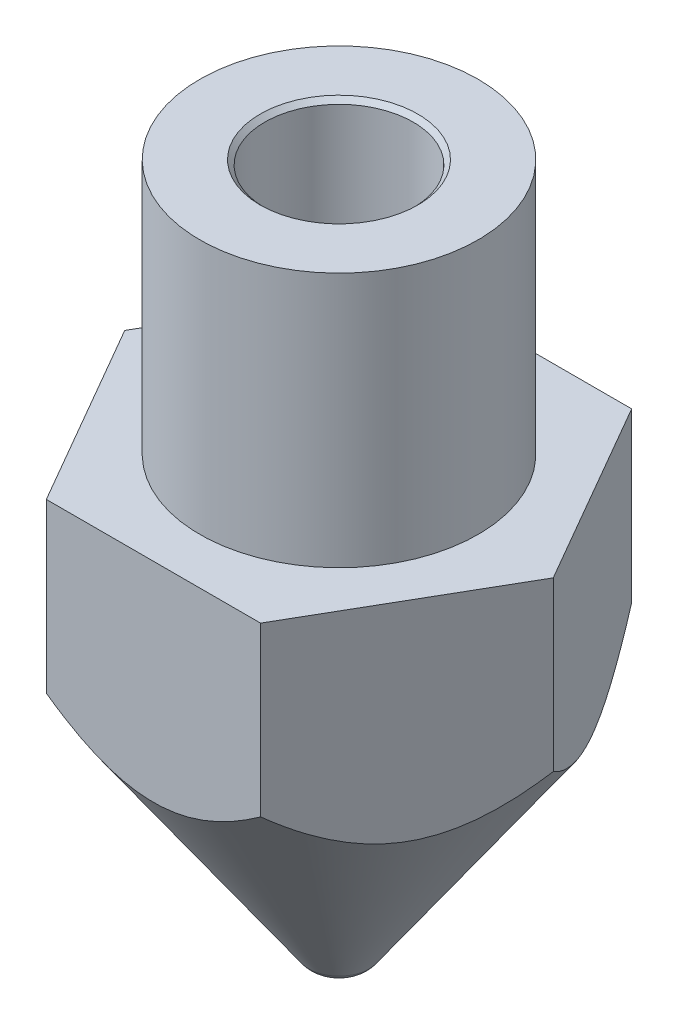
ISO-10303-21;
HEADER;
FILE_DESCRIPTION(('STEP AP214'),'2;1');
FILE_NAME('part.step','',(''),(''),'','','');
FILE_SCHEMA(('AUTOMOTIVE_DESIGN { 1 0 10303 214 1 1 1 1 }'));
ENDSEC;
DATA;
#1=APPLICATION_CONTEXT('core data for automotive mechanical design processes');
#2=APPLICATION_PROTOCOL_DEFINITION('international standard','automotive_design',2000,#1);
#3=PRODUCT_CONTEXT('',#1,'mechanical');
#4=PRODUCT('Part','Part','',(#3));
#5=PRODUCT_RELATED_PRODUCT_CATEGORY('part','',(#4));
#6=PRODUCT_DEFINITION_FORMATION('','',#4);
#7=PRODUCT_DEFINITION_CONTEXT('part definition',#1,'design');
#8=PRODUCT_DEFINITION('design','',#6,#7);
#9=PRODUCT_DEFINITION_SHAPE('','',#8);
#10=(LENGTH_UNIT() NAMED_UNIT(*) SI_UNIT(.MILLI.,.METRE.));
#11=(NAMED_UNIT(*) PLANE_ANGLE_UNIT() SI_UNIT($,.RADIAN.));
#12=(NAMED_UNIT(*) SI_UNIT($,.STERADIAN.) SOLID_ANGLE_UNIT());
#13=UNCERTAINTY_MEASURE_WITH_UNIT(LENGTH_MEASURE(1.E-05),#10,'distance_accuracy_value','');
#14=(GEOMETRIC_REPRESENTATION_CONTEXT(3) GLOBAL_UNCERTAINTY_ASSIGNED_CONTEXT((#13)) GLOBAL_UNIT_ASSIGNED_CONTEXT((#10,
#11,#12)) REPRESENTATION_CONTEXT('',''));
#15=CARTESIAN_POINT('',(0.,0.,0.));
#16=DIRECTION('',(0.,0.,1.));
#17=DIRECTION('',(1.,0.,0.));
#18=AXIS2_PLACEMENT_3D('',#15,#16,#17);
#19=CARTESIAN_POINT('',(-4.61880215351701,4.5,0.));
#20=DIRECTION('',(-0.866025403784439,0.,0.5));
#21=DIRECTION('',(0.5,0.,0.866025403784439));
#22=AXIS2_PLACEMENT_3D('',#19,#20,#21);
#23=PLANE('',#22);
#24=DIRECTION('',(0.,1.,0.));
#25=VECTOR('',#24,1.);
#26=CARTESIAN_POINT('',(-4.61880215351701,4.5,0.));
#27=LINE('',#26,#25);
#28=CARTESIAN_POINT('',(-4.61880215351701,5.88225908571051,0.));
#29=VERTEX_POINT('',#28);
#30=CARTESIAN_POINT('',(-4.61880215351701,9.5,0.));
#31=VERTEX_POINT('',#30);
#32=EDGE_CURVE('E71',#29,#31,#27,.T.);
#33=ORIENTED_EDGE('',*,*,#32,.F.);
#34=CARTESIAN_POINT('',(-4.61891762357084,5.88242400022164,-0.0002));
#35=CARTESIAN_POINT('',(-4.56925420965187,5.8115485741184,0.0858195561849922));
#36=CARTESIAN_POINT('',(-4.51877106320646,5.7428237427371,0.17325893075437));
#37=CARTESIAN_POINT('',(-4.41579013307026,5.61090411278612,0.351627133960974));
#38=CARTESIAN_POINT('',(-4.36328596681798,5.54772932961361,0.442567017518972));
#39=CARTESIAN_POINT('',(-4.25509642948085,5.42739029017653,0.629956793034243));
#40=CARTESIAN_POINT('',(-4.19936724148263,5.37038160371396,0.72648257811172));
#41=CARTESIAN_POINT('',(-4.08572315314047,5.26611540409444,0.923319913100188));
#42=CARTESIAN_POINT('',(-4.02781132768388,5.21884473789778,1.02362613715006));
#43=CARTESIAN_POINT('',(-3.92859664994934,5.1495011839163,1.19547099984287));
#44=CARTESIAN_POINT('',(-3.88785888845516,5.12419331532587,1.2660308725374));
#45=CARTESIAN_POINT('',(-3.8055092618837,5.08000172984533,1.4086646097435));
#46=CARTESIAN_POINT('',(-3.76389737722944,5.0611181569978,1.48073850816337));
#47=CARTESIAN_POINT('',(-3.68041942255837,5.03063034907599,1.6253265669656));
#48=CARTESIAN_POINT('',(-3.6385596465676,5.01895784866268,1.69782982577506));
#49=CARTESIAN_POINT('',(-3.55448560122178,5.00309384976785,1.84345034391187));
#50=CARTESIAN_POINT('',(-3.5122713560817,4.99890184437926,1.91656756129765));
#51=CARTESIAN_POINT('',(-3.42771081766634,4.99818373465271,2.06303071014844));
#52=CARTESIAN_POINT('',(-3.38536447890467,5.00167861960247,2.13637672039818));
#53=CARTESIAN_POINT('',(-3.30099851483729,5.01622029532328,2.2825028565924));
#54=CARTESIAN_POINT('',(-3.25897891250844,5.02726761242707,2.35528294273981));
#55=CARTESIAN_POINT('',(-3.1751582399521,5.05659166672368,2.500464606332));
#56=CARTESIAN_POINT('',(-3.13336331319608,5.07493796411918,2.57285554297203));
#57=CARTESIAN_POINT('',(-3.05063830759021,5.11815585117162,2.71613945573783));
#58=CARTESIAN_POINT('',(-3.00970820627463,5.14302727109865,2.78703247077535));
#59=CARTESIAN_POINT('',(-2.90934813804802,5.21187479151539,2.96086120799492));
#60=CARTESIAN_POINT('',(-2.85050623308459,5.25928206058064,3.06277837700572));
#61=CARTESIAN_POINT('',(-2.73506252983197,5.36419887003298,3.26273273645315));
#62=CARTESIAN_POINT('',(-2.67846410208005,5.42172295353161,3.360764088948));
#63=CARTESIAN_POINT('',(-2.56862033272009,5.54334681310621,3.55101907837434));
#64=CARTESIAN_POINT('',(-2.51532979172765,5.60728544714576,3.64332100293607));
#65=CARTESIAN_POINT('',(-2.41084490099045,5.74090283015609,3.82429414231618));
#66=CARTESIAN_POINT('',(-2.35964360182202,5.81055974574258,3.91297739388943));
#67=CARTESIAN_POINT('',(-2.30928560670466,5.88242400022164,4.0002));
#68=B_SPLINE_CURVE_WITH_KNOTS('',3,(#34,#35,#36,#37,#38,#39,#40,#41,#42,#43,#44,#45,#46,#47,#48,
#49,#50,#51,#52,#53,#54,#55,#56,#57,#58,#59,#60,#61,#62,#63,#64,#65,#66,#67),.UNSPECIFIED.,.F.,
.F.,(4,2,2,2,2,2,2,2,2,2,2,2,2,2,2,2,4),(0.,0.366162525937919,0.73359555504403,1.1088077325511,
1.48350974320492,1.73923335251645,1.99496269516543,2.24823245108925,2.50148504383003,
2.75543000873929,3.00939267300284,3.26583594658724,3.52227255029221,3.90226204881823,
4.28280232207685,4.65544941191468,5.02673453028271),.UNSPECIFIED.);
#69=CARTESIAN_POINT('',(-2.3094010767585,5.88225908571051,4.));
#70=VERTEX_POINT('',#69);
#71=EDGE_CURVE('E184',#29,#70,#68,.T.);
#72=ORIENTED_EDGE('',*,*,#71,.T.);
#73=DIRECTION('',(0.,1.,0.));
#74=VECTOR('',#73,1.);
#75=CARTESIAN_POINT('',(-2.3094010767585,4.5,4.));
#76=LINE('',#75,#74);
#77=CARTESIAN_POINT('',(-2.3094010767585,9.5,4.));
#78=VERTEX_POINT('',#77);
#79=EDGE_CURVE('E126',#70,#78,#76,.T.);
#80=ORIENTED_EDGE('',*,*,#79,.T.);
#81=DIRECTION('',(0.5,0.,0.866025403784439));
#82=VECTOR('',#81,1.);
#83=CARTESIAN_POINT('',(-4.61880215351701,9.5,0.));
#84=LINE('',#83,#82);
#85=EDGE_CURVE('E192',#31,#78,#84,.T.);
#86=ORIENTED_EDGE('',*,*,#85,.F.);
#87=EDGE_LOOP('',(#33,#72,#80,#86));
#88=FACE_BOUND('',#87,.T.);
#89=ADVANCED_FACE('F48',(#88),#23,.T.);
#90=CARTESIAN_POINT('',(-2.3094010767585,4.5,-4.));
#91=DIRECTION('',(-0.866025403784439,0.,-0.5));
#92=DIRECTION('',(-0.5,0.,0.866025403784439));
#93=AXIS2_PLACEMENT_3D('',#90,#91,#92);
#94=PLANE('',#93);
#95=DIRECTION('',(0.,1.,0.));
#96=VECTOR('',#95,1.);
#97=CARTESIAN_POINT('',(-2.3094010767585,4.5,-4.));
#98=LINE('',#97,#96);
#99=CARTESIAN_POINT('',(-2.3094010767585,5.88225908571051,-4.));
#100=VERTEX_POINT('',#99);
#101=CARTESIAN_POINT('',(-2.3094010767585,9.5,-4.));
#102=VERTEX_POINT('',#101);
#103=EDGE_CURVE('E124',#100,#102,#98,.T.);
#104=ORIENTED_EDGE('',*,*,#103,.F.);
#105=CARTESIAN_POINT('',(-2.30928560670467,5.88242400022164,-4.0002));
#106=CARTESIAN_POINT('',(-2.35894902062364,5.8115485741184,-3.91418044381501));
#107=CARTESIAN_POINT('',(-2.40943216706905,5.7428237427371,-3.82674106924563));
#108=CARTESIAN_POINT('',(-2.51241309720525,5.61090411278612,-3.64837286603903));
#109=CARTESIAN_POINT('',(-2.56491726345753,5.54772932961361,-3.55743298248103));
#110=CARTESIAN_POINT('',(-2.67310680079466,5.42739029017653,-3.37004320696576));
#111=CARTESIAN_POINT('',(-2.72883598879288,5.37038160371396,-3.27351742188828));
#112=CARTESIAN_POINT('',(-2.84248007713504,5.26611540409444,-3.07668008689981));
#113=CARTESIAN_POINT('',(-2.90039190259163,5.21884473789778,-2.97637386284994));
#114=CARTESIAN_POINT('',(-2.99960658032617,5.1495011839163,-2.80452900015714));
#115=CARTESIAN_POINT('',(-3.04034434182035,5.12419331532587,-2.7339691274626));
#116=CARTESIAN_POINT('',(-3.12269396839181,5.08000172984534,-2.5913353902565));
#117=CARTESIAN_POINT('',(-3.16430585304607,5.0611181569978,-2.51926149183663));
#118=CARTESIAN_POINT('',(-3.24778380771714,5.03063034907599,-2.3746734330344));
#119=CARTESIAN_POINT('',(-3.28964358370791,5.01895784866268,-2.30217017422494));
#120=CARTESIAN_POINT('',(-3.37371762905373,5.00309384976785,-2.15654965608813));
#121=CARTESIAN_POINT('',(-3.41593187419381,4.99890184437926,-2.08343243870235));
#122=CARTESIAN_POINT('',(-3.50049241260917,4.99818373465271,-1.93696928985156));
#123=CARTESIAN_POINT('',(-3.54283875137084,5.00167861960247,-1.86362327960182));
#124=CARTESIAN_POINT('',(-3.62720471543821,5.01622029532328,-1.7174971434076));
#125=CARTESIAN_POINT('',(-3.66922431776707,5.02726761242707,-1.64471705726019));
#126=CARTESIAN_POINT('',(-3.75304499032341,5.05659166672368,-1.499535393668));
#127=CARTESIAN_POINT('',(-3.79483991707942,5.07493796411918,-1.42714445702797));
#128=CARTESIAN_POINT('',(-3.8775649226853,5.11815585117162,-1.28386054426218));
#129=CARTESIAN_POINT('',(-3.91849502400088,5.14302727109865,-1.21296752922465));
#130=CARTESIAN_POINT('',(-4.01885509222749,5.21187479151539,-1.03913879200508));
#131=CARTESIAN_POINT('',(-4.07769699719092,5.25928206058064,-0.937221622994276));
#132=CARTESIAN_POINT('',(-4.19314070044354,5.36419887003298,-0.737267263546848));
#133=CARTESIAN_POINT('',(-4.24973912819546,5.42172295353161,-0.639235911052));
#134=CARTESIAN_POINT('',(-4.35958289755542,5.54334681310621,-0.448980921625666));
#135=CARTESIAN_POINT('',(-4.41287343854786,5.60728544714576,-0.35667899706393));
#136=CARTESIAN_POINT('',(-4.51735832928506,5.74090283015609,-0.175705857683818));
#137=CARTESIAN_POINT('',(-4.56855962845349,5.81055974574258,-0.0870226061105712));
#138=CARTESIAN_POINT('',(-4.61891762357084,5.88242400022164,0.000200000000000403));
#139=B_SPLINE_CURVE_WITH_KNOTS('',3,(#105,#106,#107,#108,#109,#110,#111,#112,#113,#114,#115,
#116,#117,#118,#119,#120,#121,#122,#123,#124,#125,#126,#127,#128,#129,#130,#131,#132,#133,#134,
#135,#136,#137,#138),.UNSPECIFIED.,.F.,.F.,(4,2,2,2,2,2,2,2,2,2,2,2,2,2,2,2,4),(0.,
0.366162525937919,0.73359555504403,1.1088077325511,1.48350974320492,1.73923335251645,
1.99496269516543,2.24823245108925,2.50148504383003,2.75543000873929,3.00939267300284,
3.26583594658724,3.52227255029221,3.90226204881823,4.28280232207685,4.65544941191468,
5.02673453028271),.UNSPECIFIED.);
#140=EDGE_CURVE('E193',#100,#29,#139,.T.);
#141=ORIENTED_EDGE('',*,*,#140,.T.);
#142=ORIENTED_EDGE('',*,*,#32,.T.);
#143=DIRECTION('',(-0.5,0.,0.866025403784439));
#144=VECTOR('',#143,1.);
#145=CARTESIAN_POINT('',(-2.3094010767585,9.5,-4.));
#146=LINE('',#145,#144);
#147=EDGE_CURVE('E131',#102,#31,#146,.T.);
#148=ORIENTED_EDGE('',*,*,#147,.F.);
#149=EDGE_LOOP('',(#104,#141,#142,#148));
#150=FACE_BOUND('',#149,.T.);
#151=ADVANCED_FACE('F168',(#150),#94,.T.);
#152=CARTESIAN_POINT('',(2.3094010767585,4.5,-4.));
#153=DIRECTION('',(0.,0.,-1.));
#154=DIRECTION('',(-1.,0.,0.));
#155=AXIS2_PLACEMENT_3D('',#152,#153,#154);
#156=PLANE('',#155);
#157=DIRECTION('',(0.,1.,0.));
#158=VECTOR('',#157,1.);
#159=CARTESIAN_POINT('',(2.3094010767585,4.5,-4.));
#160=LINE('',#159,#158);
#161=CARTESIAN_POINT('',(2.30940107675851,5.88225908571051,-4.));
#162=VERTEX_POINT('',#161);
#163=CARTESIAN_POINT('',(2.3094010767585,9.5,-4.));
#164=VERTEX_POINT('',#163);
#165=EDGE_CURVE('E122',#162,#164,#160,.T.);
#166=ORIENTED_EDGE('',*,*,#165,.F.);
#167=CARTESIAN_POINT('',(-3.94258326480092,7.30697822131073,-4.));
#168=CARTESIAN_POINT('',(-3.85742778987343,7.22162515283559,-4.));
#169=CARTESIAN_POINT('',(-3.77158275229101,7.13694963399356,-4.));
#170=CARTESIAN_POINT('',(-3.59826790158827,6.96923386985618,-4.));
#171=CARTESIAN_POINT('',(-3.51079766848054,6.88619405901589,-4.));
#172=CARTESIAN_POINT('',(-3.33329925069411,6.72139538256639,-4.));
#173=CARTESIAN_POINT('',(-3.2432558814832,6.6396528198817,-4.));
#174=CARTESIAN_POINT('',(-3.06104096725119,6.47858306452032,-4.));
#175=CARTESIAN_POINT('',(-2.96886958498194,6.3992556881975,-4.));
#176=CARTESIAN_POINT('',(-2.77536320997655,6.23794599281273,-4.));
#177=CARTESIAN_POINT('',(-2.67384540397962,6.15618193266831,-4.));
#178=CARTESIAN_POINT('',(-2.46754297532542,5.99689014208638,-4.));
#179=CARTESIAN_POINT('',(-2.36275880681677,5.91936182680897,-4.));
#180=CARTESIAN_POINT('',(-2.14973266362039,5.76990165764347,-4.));
#181=CARTESIAN_POINT('',(-2.04150245800315,5.69795314636924,-4.));
#182=CARTESIAN_POINT('',(-1.82080990153421,5.56092276308199,-4.));
#183=CARTESIAN_POINT('',(-1.708349750863,5.49583738646806,-4.));
#184=CARTESIAN_POINT('',(-1.48962153313732,5.38023009008192,-4.));
#185=CARTESIAN_POINT('',(-1.38377793518706,5.32891236292659,-4.));
#186=CARTESIAN_POINT('',(-1.16809041763207,5.23530449802383,-4.));
#187=CARTESIAN_POINT('',(-1.0582457597573,5.19301603632319,-4.));
#188=CARTESIAN_POINT('',(-0.836754151818251,5.12017749187347,-4.));
#189=CARTESIAN_POINT('',(-0.725169973508302,5.08943935804552,-4.));
#190=CARTESIAN_POINT('',(-0.499263614140242,5.04064284936691,-4.));
#191=CARTESIAN_POINT('',(-0.384943237780323,5.02257634279042,-4.));
#192=CARTESIAN_POINT('',(-0.186641089574639,5.00349696769108,-4.));
#193=CARTESIAN_POINT('',(-0.102969713519449,4.99915887367469,-4.));
#194=CARTESIAN_POINT('',(0.0644204461531265,4.99800981590963,-4.));
#195=CARTESIAN_POINT('',(0.148139221187687,5.00119776612135,-4.));
#196=CARTESIAN_POINT('',(0.315164715228582,5.01498178396718,-4.));
#197=CARTESIAN_POINT('',(0.398469908420173,5.02559610580833,-4.));
#198=CARTESIAN_POINT('',(0.563887962117251,5.05380893268779,-4.));
#199=CARTESIAN_POINT('',(0.646000589560762,5.0714087843588,-4.));
#200=CARTESIAN_POINT('',(0.835883580767495,5.11992271774857,-4.));
#201=CARTESIAN_POINT('',(0.943019377586153,5.15332268605727,-4.));
#202=CARTESIAN_POINT('',(1.15383196007158,5.22964881306471,-4.));
#203=CARTESIAN_POINT('',(1.25750707679334,5.27257949381334,-4.));
#204=CARTESIAN_POINT('',(1.46232392898967,5.36669889428297,-4.));
#205=CARTESIAN_POINT('',(1.56342753373363,5.41796974645532,-4.));
#206=CARTESIAN_POINT('',(1.76207158369809,5.52686604354234,-4.));
#207=CARTESIAN_POINT('',(1.85961315864223,5.58448944998259,-4.));
#208=CARTESIAN_POINT('',(2.10468056069374,5.7381979451222,-4.));
#209=CARTESIAN_POINT('',(2.2499347014263,5.83789394305458,-4.));
#210=CARTESIAN_POINT('',(2.53401574471902,6.04611945237028,-4.));
#211=CARTESIAN_POINT('',(2.67283794648359,6.15465526943053,-4.));
#212=CARTESIAN_POINT('',(2.94568921802161,6.37860154636212,-4.));
#213=CARTESIAN_POINT('',(3.07969759304218,6.49403705362876,-4.));
#214=CARTESIAN_POINT('',(3.34330563816256,6.72973447638593,-4.));
#215=CARTESIAN_POINT('',(3.47290650292592,6.84999506445181,-4.));
#216=CARTESIAN_POINT('',(3.71974531748996,7.0858487675779,-4.));
#217=CARTESIAN_POINT('',(3.83722071872224,7.20119449929638,-4.));
#218=CARTESIAN_POINT('',(4.0695881482401,7.43447404779324,-4.));
#219=CARTESIAN_POINT('',(4.18447993765639,7.55240810190084,-4.));
#220=CARTESIAN_POINT('',(4.41104780797961,7.78927669829599,-4.));
#221=CARTESIAN_POINT('',(4.52274361827049,7.90819242410238,-4.));
#222=CARTESIAN_POINT('',(4.7442749385798,8.14769310167475,-4.));
#223=CARTESIAN_POINT('',(4.85411088673336,8.26827764779529,-4.));
#224=CARTESIAN_POINT('',(4.96318464228076,8.38953801632412,-4.));
#225=B_SPLINE_CURVE_WITH_KNOTS('',3,(#167,#168,#169,#170,#171,#172,#173,#174,#175,#176,#177,
#178,#179,#180,#181,#182,#183,#184,#185,#186,#187,#188,#189,#190,#191,#192,#193,#194,#195,#196,
#197,#198,#199,#200,#201,#202,#203,#204,#205,#206,#207,#208,#209,#210,#211,#212,#213,#214,#215,
#216,#217,#218,#219,#220,#221,#222,#223,#224),.UNSPECIFIED.,.F.,.F.,(4,2,2,2,2,2,2,2,2,2,2,2,2,
2,2,2,2,2,2,2,2,2,2,2,2,2,2,2,4),(0.,0.361710548368885,0.723515908170192,1.08831750963191,
1.45309130264871,1.84405302055724,2.23496062026784,2.6246523251455,3.01414406370249,
3.36669153443568,3.71930438959535,4.06589817176844,4.41226933133591,4.66330297666128,
4.91430039899754,5.16591695671685,5.41758204329353,5.75368178885688,6.08994134624225,
6.42973876734349,6.7694274663236,7.29745499379166,7.82586253274574,8.35632096944451,
8.88663445950958,9.38049546970213,9.87440195390726,10.3638223825226,10.8531258657859),.UNSPECIFIED.);
#226=EDGE_CURVE('E104',#162,#100,#225,.F.);
#227=ORIENTED_EDGE('',*,*,#226,.T.);
#228=ORIENTED_EDGE('',*,*,#103,.T.);
#229=DIRECTION('',(-1.,0.,0.));
#230=VECTOR('',#229,1.);
#231=CARTESIAN_POINT('',(2.3094010767585,9.5,-4.));
#232=LINE('',#231,#230);
#233=EDGE_CURVE('E249',#164,#102,#232,.T.);
#234=ORIENTED_EDGE('',*,*,#233,.F.);
#235=EDGE_LOOP('',(#166,#227,#228,#234));
#236=FACE_BOUND('',#235,.T.);
#237=ADVANCED_FACE('F174',(#236),#156,.T.);
#238=CARTESIAN_POINT('',(4.618802153517,4.5,0.));
#239=DIRECTION('',(0.866025403784439,0.,-0.5));
#240=DIRECTION('',(-0.5,0.,-0.866025403784439));
#241=AXIS2_PLACEMENT_3D('',#238,#239,#240);
#242=PLANE('',#241);
#243=DIRECTION('',(0.,1.,0.));
#244=VECTOR('',#243,1.);
#245=CARTESIAN_POINT('',(4.618802153517,4.5,0.));
#246=LINE('',#245,#244);
#247=CARTESIAN_POINT('',(4.61880215351701,5.88225908571051,0.));
#248=VERTEX_POINT('',#247);
#249=CARTESIAN_POINT('',(4.618802153517,9.5,0.));
#250=VERTEX_POINT('',#249);
#251=EDGE_CURVE('E113',#248,#250,#246,.T.);
#252=ORIENTED_EDGE('',*,*,#251,.F.);
#253=CARTESIAN_POINT('',(4.61891762357084,5.88242400022164,0.0002));
#254=CARTESIAN_POINT('',(4.56925420965187,5.81154857411839,-0.0858195561849916));
#255=CARTESIAN_POINT('',(4.51877106320646,5.7428237427371,-0.17325893075437));
#256=CARTESIAN_POINT('',(4.41579013307026,5.61090411278611,-0.351627133960974));
#257=CARTESIAN_POINT('',(4.36328596681798,5.54772932961361,-0.442567017518972));
#258=CARTESIAN_POINT('',(4.25509642948085,5.42739029017653,-0.629956793034243));
#259=CARTESIAN_POINT('',(4.19936724148263,5.37038160371396,-0.72648257811172));
#260=CARTESIAN_POINT('',(4.08572315314047,5.26611540409444,-0.923319913100187));
#261=CARTESIAN_POINT('',(4.02781132768388,5.21884473789777,-1.02362613715006));
#262=CARTESIAN_POINT('',(3.92859664994934,5.1495011839163,-1.19547099984287));
#263=CARTESIAN_POINT('',(3.88785888845516,5.12419331532587,-1.2660308725374));
#264=CARTESIAN_POINT('',(3.8055092618837,5.08000172984533,-1.4086646097435));
#265=CARTESIAN_POINT('',(3.76389737722944,5.0611181569978,-1.48073850816337));
#266=CARTESIAN_POINT('',(3.68041942255837,5.03063034907599,-1.6253265669656));
#267=CARTESIAN_POINT('',(3.6385596465676,5.01895784866268,-1.69782982577506));
#268=CARTESIAN_POINT('',(3.55448560122178,5.00309384976785,-1.84345034391188));
#269=CARTESIAN_POINT('',(3.5122713560817,4.99890184437926,-1.91656756129765));
#270=CARTESIAN_POINT('',(3.42771081766634,4.99818373465271,-2.06303071014844));
#271=CARTESIAN_POINT('',(3.38536447890467,5.00167861960247,-2.13637672039818));
#272=CARTESIAN_POINT('',(3.30099851483729,5.01622029532328,-2.2825028565924));
#273=CARTESIAN_POINT('',(3.25897891250844,5.02726761242707,-2.35528294273981));
#274=CARTESIAN_POINT('',(3.1751582399521,5.05659166672368,-2.500464606332));
#275=CARTESIAN_POINT('',(3.13336331319609,5.07493796411918,-2.57285554297203));
#276=CARTESIAN_POINT('',(3.05063830759021,5.11815585117162,-2.71613945573783));
#277=CARTESIAN_POINT('',(3.00970820627463,5.14302727109865,-2.78703247077535));
#278=CARTESIAN_POINT('',(2.90934813804802,5.21187479151539,-2.96086120799492));
#279=CARTESIAN_POINT('',(2.85050623308459,5.25928206058064,-3.06277837700573));
#280=CARTESIAN_POINT('',(2.73506252983197,5.36419887003298,-3.26273273645315));
#281=CARTESIAN_POINT('',(2.67846410208005,5.42172295353161,-3.360764088948));
#282=CARTESIAN_POINT('',(2.56862033272009,5.54334681310621,-3.55101907837434));
#283=CARTESIAN_POINT('',(2.51532979172765,5.60728544714576,-3.64332100293607));
#284=CARTESIAN_POINT('',(2.41084490099045,5.7409028301561,-3.82429414231618));
#285=CARTESIAN_POINT('',(2.35964360182203,5.81055974574258,-3.91297739388943));
#286=CARTESIAN_POINT('',(2.30928560670467,5.88242400022164,-4.0002));
#287=B_SPLINE_CURVE_WITH_KNOTS('',3,(#253,#254,#255,#256,#257,#258,#259,#260,#261,#262,#263,
#264,#265,#266,#267,#268,#269,#270,#271,#272,#273,#274,#275,#276,#277,#278,#279,#280,#281,#282,
#283,#284,#285,#286),.UNSPECIFIED.,.F.,.F.,(4,2,2,2,2,2,2,2,2,2,2,2,2,2,2,2,4),(0.,
0.366162525937918,0.733595555044028,1.1088077325511,1.48350974320492,1.73923335251645,
1.99496269516543,2.24823245108925,2.50148504383003,2.75543000873929,3.00939267300284,
3.26583594658724,3.52227255029221,3.90226204881823,4.28280232207685,4.65544941191468,
5.02673453028271),.UNSPECIFIED.);
#288=EDGE_CURVE('E101',#248,#162,#287,.T.);
#289=ORIENTED_EDGE('',*,*,#288,.T.);
#290=ORIENTED_EDGE('',*,*,#165,.T.);
#291=DIRECTION('',(-0.5,0.,-0.866025403784439));
#292=VECTOR('',#291,1.);
#293=CARTESIAN_POINT('',(4.618802153517,9.5,0.));
#294=LINE('',#293,#292);
#295=EDGE_CURVE('E120',#250,#164,#294,.T.);
#296=ORIENTED_EDGE('',*,*,#295,.F.);
#297=EDGE_LOOP('',(#252,#289,#290,#296));
#298=FACE_BOUND('',#297,.T.);
#299=ADVANCED_FACE('F118',(#298),#242,.T.);
#300=CARTESIAN_POINT('',(2.3094010767585,4.5,4.));
#301=DIRECTION('',(0.866025403784439,0.,0.5));
#302=DIRECTION('',(0.5,0.,-0.866025403784439));
#303=AXIS2_PLACEMENT_3D('',#300,#301,#302);
#304=PLANE('',#303);
#305=DIRECTION('',(0.,1.,0.));
#306=VECTOR('',#305,1.);
#307=CARTESIAN_POINT('',(2.3094010767585,4.5,4.));
#308=LINE('',#307,#306);
#309=CARTESIAN_POINT('',(2.3094010767585,5.88225908571051,4.));
#310=VERTEX_POINT('',#309);
#311=CARTESIAN_POINT('',(2.3094010767585,9.5,4.));
#312=VERTEX_POINT('',#311);
#313=EDGE_CURVE('E115',#310,#312,#308,.T.);
#314=ORIENTED_EDGE('',*,*,#313,.F.);
#315=CARTESIAN_POINT('',(2.30928560670467,5.88242400022164,4.0002));
#316=CARTESIAN_POINT('',(2.35894902062364,5.8115485741184,3.91418044381501));
#317=CARTESIAN_POINT('',(2.40943216706905,5.7428237427371,3.82674106924563));
#318=CARTESIAN_POINT('',(2.51241309720525,5.61090411278611,3.64837286603902));
#319=CARTESIAN_POINT('',(2.56491726345753,5.54772932961361,3.55743298248103));
#320=CARTESIAN_POINT('',(2.67310680079466,5.42739029017653,3.37004320696576));
#321=CARTESIAN_POINT('',(2.72883598879288,5.37038160371396,3.27351742188828));
#322=CARTESIAN_POINT('',(2.84248007713504,5.26611540409444,3.07668008689981));
#323=CARTESIAN_POINT('',(2.90039190259163,5.21884473789777,2.97637386284994));
#324=CARTESIAN_POINT('',(2.99960658032617,5.1495011839163,2.80452900015713));
#325=CARTESIAN_POINT('',(3.04034434182035,5.12419331532587,2.7339691274626));
#326=CARTESIAN_POINT('',(3.12269396839181,5.08000172984533,2.5913353902565));
#327=CARTESIAN_POINT('',(3.16430585304607,5.0611181569978,2.51926149183663));
#328=CARTESIAN_POINT('',(3.24778380771714,5.03063034907599,2.3746734330344));
#329=CARTESIAN_POINT('',(3.28964358370791,5.01895784866268,2.30217017422494));
#330=CARTESIAN_POINT('',(3.37371762905373,5.00309384976785,2.15654965608813));
#331=CARTESIAN_POINT('',(3.41593187419381,4.99890184437926,2.08343243870235));
#332=CARTESIAN_POINT('',(3.50049241260917,4.99818373465271,1.93696928985156));
#333=CARTESIAN_POINT('',(3.54283875137084,5.00167861960247,1.86362327960182));
#334=CARTESIAN_POINT('',(3.62720471543821,5.01622029532328,1.7174971434076));
#335=CARTESIAN_POINT('',(3.66922431776707,5.02726761242706,1.64471705726019));
#336=CARTESIAN_POINT('',(3.75304499032341,5.05659166672367,1.499535393668));
#337=CARTESIAN_POINT('',(3.79483991707942,5.07493796411918,1.42714445702797));
#338=CARTESIAN_POINT('',(3.8775649226853,5.11815585117162,1.28386054426217));
#339=CARTESIAN_POINT('',(3.91849502400088,5.14302727109865,1.21296752922465));
#340=CARTESIAN_POINT('',(4.01885509222749,5.21187479151539,1.03913879200508));
#341=CARTESIAN_POINT('',(4.07769699719092,5.25928206058064,0.937221622994275));
#342=CARTESIAN_POINT('',(4.19314070044353,5.36419887003297,0.737267263546847));
#343=CARTESIAN_POINT('',(4.24973912819546,5.42172295353161,0.639235911051999));
#344=CARTESIAN_POINT('',(4.35958289755542,5.5433468131062,0.448980921625665));
#345=CARTESIAN_POINT('',(4.41287343854786,5.60728544714576,0.356678997063929));
#346=CARTESIAN_POINT('',(4.51735832928506,5.74090283015609,0.175705857683818));
#347=CARTESIAN_POINT('',(4.56855962845348,5.81055974574257,0.0870226061105717));
#348=CARTESIAN_POINT('',(4.61891762357084,5.88242400022164,-0.000199999999999878));
#349=B_SPLINE_CURVE_WITH_KNOTS('',3,(#315,#316,#317,#318,#319,#320,#321,#322,#323,#324,#325,
#326,#327,#328,#329,#330,#331,#332,#333,#334,#335,#336,#337,#338,#339,#340,#341,#342,#343,#344,
#345,#346,#347,#348),.UNSPECIFIED.,.F.,.F.,(4,2,2,2,2,2,2,2,2,2,2,2,2,2,2,2,4),(0.,
0.366162525937918,0.733595555044029,1.1088077325511,1.48350974320492,1.73923335251645,
1.99496269516543,2.24823245108924,2.50148504383003,2.75543000873929,3.00939267300284,
3.26583594658724,3.52227255029221,3.90226204881822,4.28280232207685,4.65544941191468,
5.02673453028271),.UNSPECIFIED.);
#350=EDGE_CURVE('E63',#310,#248,#349,.T.);
#351=ORIENTED_EDGE('',*,*,#350,.T.);
#352=ORIENTED_EDGE('',*,*,#251,.T.);
#353=DIRECTION('',(0.5,0.,-0.866025403784439));
#354=VECTOR('',#353,1.);
#355=CARTESIAN_POINT('',(2.3094010767585,9.5,4.));
#356=LINE('',#355,#354);
#357=EDGE_CURVE('E252',#312,#250,#356,.T.);
#358=ORIENTED_EDGE('',*,*,#357,.F.);
#359=EDGE_LOOP('',(#314,#351,#352,#358));
#360=FACE_BOUND('',#359,.T.);
#361=ADVANCED_FACE('F111',(#360),#304,.T.);
#362=CARTESIAN_POINT('',(-2.3094010767585,4.5,4.));
#363=DIRECTION('',(0.,0.,1.));
#364=DIRECTION('',(1.,0.,0.));
#365=AXIS2_PLACEMENT_3D('',#362,#363,#364);
#366=PLANE('',#365);
#367=ORIENTED_EDGE('',*,*,#79,.F.);
#368=CARTESIAN_POINT('',(-3.94258326616504,7.3069782226783,4.));
#369=CARTESIAN_POINT('',(-3.85742779120049,7.22162515415103,4.));
#370=CARTESIAN_POINT('',(-3.77158275358076,7.13694963525699,4.));
#371=CARTESIAN_POINT('',(-3.59826790280276,6.96923387101595,4.));
#372=CARTESIAN_POINT('',(-3.51079766965707,6.88619406012401,4.));
#373=CARTESIAN_POINT('',(-3.33329925179298,6.72139538357076,4.));
#374=CARTESIAN_POINT('',(-3.24325588254235,6.63965282083399,4.));
#375=CARTESIAN_POINT('',(-3.06104096822977,6.47858306536928,4.));
#376=CARTESIAN_POINT('',(-2.96886958591967,6.39925568899519,4.));
#377=CARTESIAN_POINT('',(-2.77536321082078,6.23794599349934,4.));
#378=CARTESIAN_POINT('',(-2.6738454047709,6.15618193329543,4.));
#379=CARTESIAN_POINT('',(-2.46754297600803,5.99689014259728,4.));
#380=CARTESIAN_POINT('',(-2.36275880744365,5.91936182726312,4.));
#381=CARTESIAN_POINT('',(-2.14973266413266,5.7699016579886,4.));
#382=CARTESIAN_POINT('',(-2.04150245845656,5.69795314666205,4.));
#383=CARTESIAN_POINT('',(-1.82080990186541,5.56092276327634,4.));
#384=CARTESIAN_POINT('',(-1.70834975113085,5.49583738661626,4.));
#385=CARTESIAN_POINT('',(-1.48962153331025,5.38023009016732,4.));
#386=CARTESIAN_POINT('',(-1.38377793533004,5.32891236299236,4.));
#387=CARTESIAN_POINT('',(-1.16809041771269,5.2353044980551,4.));
#388=CARTESIAN_POINT('',(-1.05824575980551,5.19301603633957,4.));
#389=CARTESIAN_POINT('',(-0.836754151801545,5.12017749186745,4.));
#390=CARTESIAN_POINT('',(-0.725169973459181,5.08943935803169,4.));
#391=CARTESIAN_POINT('',(-0.499263614024998,5.04064284934522,4.));
#392=CARTESIAN_POINT('',(-0.384943237631373,5.02257634276866,4.));
#393=CARTESIAN_POINT('',(-0.186641089393257,5.00349696767902,4.));
#394=CARTESIAN_POINT('',(-0.102969713339508,4.99915887366812,4.));
#395=CARTESIAN_POINT('',(0.0644204463297031,4.99800981591374,4.));
#396=CARTESIAN_POINT('',(0.14813922136234,5.00119776613065,4.));
#397=CARTESIAN_POINT('',(0.315164715399222,5.01498178398638,4.));
#398=CARTESIAN_POINT('',(0.398469908588721,5.02559610583227,4.));
#399=CARTESIAN_POINT('',(0.563887962281316,5.05380893272058,4.));
#400=CARTESIAN_POINT('',(0.646000589722434,5.0714087843957,4.));
#401=CARTESIAN_POINT('',(0.835883580933244,5.11992271779679,4.));
#402=CARTESIAN_POINT('',(0.943019377758044,5.15332268611346,4.));
#403=CARTESIAN_POINT('',(1.15383196025508,5.2296488131372,4.));
#404=CARTESIAN_POINT('',(1.25750707698229,5.27257949389418,4.));
#405=CARTESIAN_POINT('',(1.46232392918898,5.36669889438062,4.));
#406=CARTESIAN_POINT('',(1.56342753393785,5.41796974656143,4.));
#407=CARTESIAN_POINT('',(1.76207158391177,5.52686604366531,4.));
#408=CARTESIAN_POINT('',(1.85961315886047,5.58448945011395,4.));
#409=CARTESIAN_POINT('',(2.10468056093988,5.73819794528518,4.));
#410=CARTESIAN_POINT('',(2.24993470169478,5.83789394324206,4.));
#411=CARTESIAN_POINT('',(2.53401574503068,6.04611945260802,4.));
#412=CARTESIAN_POINT('',(2.67283794681611,6.15465526969404,4.));
#413=CARTESIAN_POINT('',(2.94568921839491,6.37860154667794,4.));
#414=CARTESIAN_POINT('',(3.07969759343541,6.49403705397114,4.));
#415=CARTESIAN_POINT('',(3.34330563859499,6.72973447678178,4.));
#416=CARTESIAN_POINT('',(3.47290650337761,6.84999506487457,4.));
#417=CARTESIAN_POINT('',(3.71974531797744,7.08584876805189,4.));
#418=CARTESIAN_POINT('',(3.83722071922631,7.20119449979465,4.));
#419=CARTESIAN_POINT('',(4.06958814877712,7.43447404834014,4.));
#420=CARTESIAN_POINT('',(4.18447993820978,7.55240810247207,4.));
#421=CARTESIAN_POINT('',(4.4110478085654,7.78927669891568,4.));
#422=CARTESIAN_POINT('',(4.52274361887233,7.90819242474618,4.));
#423=CARTESIAN_POINT('',(4.74427493921364,8.14769310236678,4.));
#424=CARTESIAN_POINT('',(4.85411088738314,8.26827764851143,4.));
#425=CARTESIAN_POINT('',(4.96318464294647,8.38953801706436,4.));
#426=B_SPLINE_CURVE_WITH_KNOTS('',3,(#368,#369,#370,#371,#372,#373,#374,#375,#376,#377,#378,
#379,#380,#381,#382,#383,#384,#385,#386,#387,#388,#389,#390,#391,#392,#393,#394,#395,#396,#397,
#398,#399,#400,#401,#402,#403,#404,#405,#406,#407,#408,#409,#410,#411,#412,#413,#414,#415,#416,
#417,#418,#419,#420,#421,#422,#423,#424,#425),.UNSPECIFIED.,.F.,.F.,(4,2,2,2,2,2,2,2,2,2,2,2,2,
2,2,2,2,2,2,2,2,2,2,2,2,2,2,2,4),(0.,0.36171054855811,0.723515908548709,1.08831751020365,
1.45309130341364,1.84405302155777,2.23496062150389,2.62465232661527,3.01414406540561,
3.3666915362451,3.71930439151112,4.06589817378364,4.41226933345019,4.66330297877042,
4.91430040110153,5.16591695881645,5.41758204538875,5.75368179097675,6.08994134838682,
6.42973876951268,6.76942746851738,7.29745499608216,7.82586253513309,8.35632097192918,
8.88663446209151,9.38049547237059,9.87440195666228,10.3638223853633,10.8531258687123),.UNSPECIFIED.);
#427=EDGE_CURVE('E116',#70,#310,#426,.T.);
#428=ORIENTED_EDGE('',*,*,#427,.T.);
#429=ORIENTED_EDGE('',*,*,#313,.T.);
#430=DIRECTION('',(1.,0.,0.));
#431=VECTOR('',#430,1.);
#432=CARTESIAN_POINT('',(-2.3094010767585,9.5,4.));
#433=LINE('',#432,#431);
#434=EDGE_CURVE('E240',#78,#312,#433,.T.);
#435=ORIENTED_EDGE('',*,*,#434,.F.);
#436=EDGE_LOOP('',(#367,#428,#429,#435));
#437=FACE_BOUND('',#436,.T.);
#438=ADVANCED_FACE('F179',(#437),#366,.T.);
#439=CARTESIAN_POINT('',(1.6,15.,0.));
#440=DIRECTION('',(0.,1.,0.));
#441=DIRECTION('',(0.,0.,1.));
#442=AXIS2_PLACEMENT_3D('',#439,#440,#441);
#443=PLANE('',#442);
#444=CARTESIAN_POINT('',(0.,15.,0.));
#445=DIRECTION('',(0.,1.,0.));
#446=DIRECTION('',(0.,0.,1.));
#447=AXIS2_PLACEMENT_3D('',#444,#445,#446);
#448=CIRCLE('',#447,1.7);
#449=CARTESIAN_POINT('',(0.,15.,1.7));
#450=VERTEX_POINT('',#449);
#451=EDGE_CURVE('E56',#450,#450,#448,.F.);
#452=ORIENTED_EDGE('',*,*,#451,.T.);
#453=EDGE_LOOP('',(#452));
#454=FACE_BOUND('',#453,.T.);
#455=CARTESIAN_POINT('',(0.,15.,0.));
#456=DIRECTION('',(0.,-1.,0.));
#457=DIRECTION('',(0.,0.,-1.));
#458=AXIS2_PLACEMENT_3D('',#455,#456,#457);
#459=CIRCLE('',#458,3.);
#460=CARTESIAN_POINT('',(0.,15.,-3.));
#461=VERTEX_POINT('',#460);
#462=EDGE_CURVE('E144',#461,#461,#459,.T.);
#463=ORIENTED_EDGE('',*,*,#462,.F.);
#464=EDGE_LOOP('',(#463));
#465=FACE_BOUND('',#464,.T.);
#466=ADVANCED_FACE('F155',(#454,#465),#443,.T.);
#467=CARTESIAN_POINT('',(0.,0.,0.));
#468=DIRECTION('',(0.,-1.,0.));
#469=DIRECTION('',(0.,0.,-1.));
#470=AXIS2_PLACEMENT_3D('',#467,#468,#469);
#471=CYLINDRICAL_SURFACE('',#470,3.);
#472=ORIENTED_EDGE('',*,*,#462,.T.);
#473=EDGE_LOOP('',(#472));
#474=FACE_BOUND('',#473,.T.);
#475=CARTESIAN_POINT('',(0.,9.5,0.));
#476=DIRECTION('',(0.,-1.,0.));
#477=DIRECTION('',(0.,0.,-1.));
#478=AXIS2_PLACEMENT_3D('',#475,#476,#477);
#479=CIRCLE('',#478,3.);
#480=CARTESIAN_POINT('',(0.,9.5,-3.));
#481=VERTEX_POINT('',#480);
#482=EDGE_CURVE('E141',#481,#481,#479,.T.);
#483=ORIENTED_EDGE('',*,*,#482,.F.);
#484=EDGE_LOOP('',(#483));
#485=FACE_BOUND('',#484,.T.);
#486=ADVANCED_FACE('F235',(#474,#485),#471,.T.);
#487=CARTESIAN_POINT('',(3.65093392194366,9.5,0.));
#488=DIRECTION('',(0.,1.,0.));
#489=DIRECTION('',(0.,0.,1.));
#490=AXIS2_PLACEMENT_3D('',#487,#488,#489);
#491=PLANE('',#490);
#492=ORIENTED_EDGE('',*,*,#482,.T.);
#493=EDGE_LOOP('',(#492));
#494=FACE_BOUND('',#493,.T.);
#495=ORIENTED_EDGE('',*,*,#85,.T.);
#496=ORIENTED_EDGE('',*,*,#434,.T.);
#497=ORIENTED_EDGE('',*,*,#357,.T.);
#498=ORIENTED_EDGE('',*,*,#295,.T.);
#499=ORIENTED_EDGE('',*,*,#233,.T.);
#500=ORIENTED_EDGE('',*,*,#147,.T.);
#501=EDGE_LOOP('',(#495,#496,#497,#498,#499,#500));
#502=FACE_BOUND('',#501,.T.);
#503=ADVANCED_FACE('F254',(#494,#502),#491,.T.);
#504=CARTESIAN_POINT('',(0.,0.,0.));
#505=DIRECTION('',(0.,1.,0.));
#506=DIRECTION('',(0.,0.,1.));
#507=AXIS2_PLACEMENT_3D('',#504,#505,#506);
#508=CONICAL_SURFACE('',#507,0.5,0.61086523819801);
#509=CARTESIAN_POINT('',(0.,0.213211781824479,0.));
#510=DIRECTION('',(0.,-1.,0.));
#511=DIRECTION('',(0.,0.,-1.));
#512=AXIS2_PLACEMENT_3D('',#509,#510,#511);
#513=CIRCLE('',#512,0.649292496868623);
#514=CARTESIAN_POINT('',(0.,0.213211781824479,-0.649292496868623));
#515=VERTEX_POINT('',#514);
#516=EDGE_CURVE('E150',#515,#515,#513,.F.);
#517=ORIENTED_EDGE('',*,*,#516,.T.);
#518=EDGE_LOOP('',(#517));
#519=FACE_BOUND('',#518,.T.);
#520=ORIENTED_EDGE('',*,*,#140,.F.);
#521=ORIENTED_EDGE('',*,*,#226,.F.);
#522=ORIENTED_EDGE('',*,*,#288,.F.);
#523=ORIENTED_EDGE('',*,*,#350,.F.);
#524=ORIENTED_EDGE('',*,*,#427,.F.);
#525=ORIENTED_EDGE('',*,*,#71,.F.);
#526=EDGE_LOOP('',(#520,#521,#522,#523,#524,#525));
#527=FACE_BOUND('',#526,.T.);
#528=ADVANCED_FACE('F102',(#519,#527),#508,.T.);
#529=CARTESIAN_POINT('',(0.5,0.,0.));
#530=DIRECTION('',(0.,-1.,0.));
#531=DIRECTION('',(0.,0.,-1.));
#532=AXIS2_PLACEMENT_3D('',#529,#530,#531);
#533=PLANE('',#532);
#534=CARTESIAN_POINT('',(0.,0.,0.));
#535=DIRECTION('',(0.,-1.,0.));
#536=DIRECTION('',(0.,0.,-1.));
#537=AXIS2_PLACEMENT_3D('',#534,#535,#536);
#538=CIRCLE('',#537,0.239716474724125);
#539=CARTESIAN_POINT('',(0.,0.,-0.239716474724125));
#540=VERTEX_POINT('',#539);
#541=EDGE_CURVE('E147',#540,#540,#538,.T.);
#542=ORIENTED_EDGE('',*,*,#541,.T.);
#543=EDGE_LOOP('',(#542));
#544=FACE_BOUND('',#543,.T.);
#545=CARTESIAN_POINT('',(0.,0.,0.));
#546=DIRECTION('',(0.,-1.,0.));
#547=DIRECTION('',(0.,0.,-1.));
#548=AXIS2_PLACEMENT_3D('',#545,#546,#547);
#549=CIRCLE('',#548,0.200000000000001);
#550=CARTESIAN_POINT('',(0.,0.,-0.200000000000001));
#551=VERTEX_POINT('',#550);
#552=EDGE_CURVE('E138',#551,#551,#549,.T.);
#553=ORIENTED_EDGE('',*,*,#552,.F.);
#554=EDGE_LOOP('',(#553));
#555=FACE_BOUND('',#554,.T.);
#556=ADVANCED_FACE('F262',(#544,#555),#533,.T.);
#557=CARTESIAN_POINT('',(0.,0.,0.));
#558=DIRECTION('',(0.,-1.,0.));
#559=DIRECTION('',(0.,0.,-1.));
#560=AXIS2_PLACEMENT_3D('',#557,#558,#559);
#561=CYLINDRICAL_SURFACE('',#560,0.2);
#562=ORIENTED_EDGE('',*,*,#552,.T.);
#563=EDGE_LOOP('',(#562));
#564=FACE_BOUND('',#563,.T.);
#565=CARTESIAN_POINT('',(0.,1.2,0.));
#566=DIRECTION('',(0.,-1.,0.));
#567=DIRECTION('',(0.,0.,-1.));
#568=AXIS2_PLACEMENT_3D('',#565,#566,#567);
#569=CIRCLE('',#568,0.2);
#570=CARTESIAN_POINT('',(0.,1.2,0.2));
#571=VERTEX_POINT('',#570);
#572=EDGE_CURVE('E135',#571,#571,#569,.T.);
#573=ORIENTED_EDGE('',*,*,#572,.F.);
#574=EDGE_LOOP('',(#573));
#575=FACE_BOUND('',#574,.T.);
#576=ADVANCED_FACE('F270',(#564,#575),#561,.F.);
#577=CARTESIAN_POINT('',(0.,3.19940720943899,0.));
#578=DIRECTION('',(0.,1.,0.));
#579=DIRECTION('',(0.,0.,1.));
#580=AXIS2_PLACEMENT_3D('',#577,#578,#579);
#581=CONICAL_SURFACE('',#580,1.6,0.610865238198009);
#582=CARTESIAN_POINT('',(0.,3.19940720943899,0.));
#583=DIRECTION('',(0.,-1.,0.));
#584=DIRECTION('',(0.,0.,-1.));
#585=AXIS2_PLACEMENT_3D('',#582,#583,#584);
#586=CIRCLE('',#585,1.6);
#587=CARTESIAN_POINT('',(0.,3.19940720943899,1.6));
#588=VERTEX_POINT('',#587);
#589=EDGE_CURVE('E132',#588,#588,#586,.T.);
#590=CARTESIAN_POINT('',(0.,1.2,0.2));
#591=CARTESIAN_POINT('',(0.,1.22082715843166,0.214583333333333));
#592=CARTESIAN_POINT('',(0.,1.24165431686331,0.229166666666667));
#593=CARTESIAN_POINT('',(0.,1.28330863372662,0.258333333333333));
#594=CARTESIAN_POINT('',(0.,1.30413579215828,0.272916666666667));
#595=CARTESIAN_POINT('',(0.,1.34579010902159,0.302083333333333));
#596=CARTESIAN_POINT('',(0.,1.36661726745325,0.316666666666667));
#597=CARTESIAN_POINT('',(0.,1.40827158431656,0.345833333333333));
#598=CARTESIAN_POINT('',(0.,1.42909874274822,0.360416666666667));
#599=CARTESIAN_POINT('',(0.,1.47075305961153,0.389583333333333));
#600=CARTESIAN_POINT('',(0.,1.49158021804319,0.404166666666667));
#601=CARTESIAN_POINT('',(0.,1.5332345349065,0.433333333333333));
#602=CARTESIAN_POINT('',(0.,1.55406169333815,0.447916666666667));
#603=CARTESIAN_POINT('',(0.,1.59571601020147,0.477083333333333));
#604=CARTESIAN_POINT('',(0.,1.61654316863312,0.491666666666667));
#605=CARTESIAN_POINT('',(0.,1.65819748549643,0.520833333333334));
#606=CARTESIAN_POINT('',(0.,1.67902464392809,0.535416666666667));
#607=CARTESIAN_POINT('',(0.,1.7206789607914,0.564583333333333));
#608=CARTESIAN_POINT('',(0.,1.74150611922306,0.579166666666667));
#609=CARTESIAN_POINT('',(0.,1.78316043608637,0.608333333333333));
#610=CARTESIAN_POINT('',(0.,1.80398759451803,0.622916666666667));
#611=CARTESIAN_POINT('',(0.,1.84564191138134,0.652083333333333));
#612=CARTESIAN_POINT('',(0.,1.866469069813,0.666666666666667));
#613=CARTESIAN_POINT('',(0.,1.90812338667631,0.695833333333333));
#614=CARTESIAN_POINT('',(0.,1.92895054510796,0.710416666666667));
#615=CARTESIAN_POINT('',(0.,1.97060486197128,0.739583333333333));
#616=CARTESIAN_POINT('',(0.,1.99143202040293,0.754166666666667));
#617=CARTESIAN_POINT('',(0.,2.03308633726624,0.783333333333334));
#618=CARTESIAN_POINT('',(0.,2.0539134956979,0.797916666666667));
#619=CARTESIAN_POINT('',(0.,2.09556781256121,0.827083333333334));
#620=CARTESIAN_POINT('',(0.,2.11639497099287,0.841666666666667));
#621=CARTESIAN_POINT('',(0.,2.15804928785618,0.870833333333334));
#622=CARTESIAN_POINT('',(0.,2.17887644628784,0.885416666666667));
#623=CARTESIAN_POINT('',(0.,2.22053076315115,0.914583333333334));
#624=CARTESIAN_POINT('',(0.,2.24135792158281,0.929166666666667));
#625=CARTESIAN_POINT('',(0.,2.28301223844612,0.958333333333334));
#626=CARTESIAN_POINT('',(0.,2.30383939687777,0.972916666666667));
#627=CARTESIAN_POINT('',(0.,2.34549371374109,1.00208333333333));
#628=CARTESIAN_POINT('',(0.,2.36632087217274,1.01666666666667));
#629=CARTESIAN_POINT('',(0.,2.40797518903605,1.04583333333333));
#630=CARTESIAN_POINT('',(0.,2.42880234746771,1.06041666666667));
#631=CARTESIAN_POINT('',(0.,2.47045666433102,1.08958333333333));
#632=CARTESIAN_POINT('',(0.,2.49128382276268,1.10416666666667));
#633=CARTESIAN_POINT('',(0.,2.53293813962599,1.13333333333333));
#634=CARTESIAN_POINT('',(0.,2.55376529805765,1.14791666666667));
#635=CARTESIAN_POINT('',(0.,2.59541961492096,1.17708333333333));
#636=CARTESIAN_POINT('',(0.,2.61624677335262,1.19166666666667));
#637=CARTESIAN_POINT('',(0.,2.65790109021593,1.22083333333333));
#638=CARTESIAN_POINT('',(0.,2.67872824864758,1.23541666666667));
#639=CARTESIAN_POINT('',(0.,2.7203825655109,1.26458333333333));
#640=CARTESIAN_POINT('',(0.,2.74120972394255,1.27916666666667));
#641=CARTESIAN_POINT('',(0.,2.78286404080586,1.30833333333333));
#642=CARTESIAN_POINT('',(0.,2.80369119923752,1.32291666666667));
#643=CARTESIAN_POINT('',(0.,2.84534551610083,1.35208333333333));
#644=CARTESIAN_POINT('',(0.,2.86617267453249,1.36666666666667));
#645=CARTESIAN_POINT('',(0.,2.9078269913958,1.39583333333333));
#646=CARTESIAN_POINT('',(0.,2.92865414982746,1.41041666666667));
#647=CARTESIAN_POINT('',(0.,2.97030846669077,1.43958333333333));
#648=CARTESIAN_POINT('',(0.,2.99113562512242,1.45416666666667));
#649=CARTESIAN_POINT('',(0.,3.03278994198574,1.48333333333333));
#650=CARTESIAN_POINT('',(0.,3.05361710041739,1.49791666666667));
#651=CARTESIAN_POINT('',(0.,3.09527141728071,1.52708333333333));
#652=CARTESIAN_POINT('',(0.,3.11609857571236,1.54166666666667));
#653=CARTESIAN_POINT('',(0.,3.15775289257567,1.57083333333333));
#654=CARTESIAN_POINT('',(0.,3.17858005100733,1.58541666666667));
#655=CARTESIAN_POINT('',(0.,3.19940720943899,1.6));
#656=B_SPLINE_CURVE_WITH_KNOTS('',3,(#590,#591,#592,#593,#594,#595,#596,#597,#598,#599,#600,
#601,#602,#603,#604,#605,#606,#607,#608,#609,#610,#611,#612,#613,#614,#615,#616,#617,#618,#619,
#620,#621,#622,#623,#624,#625,#626,#627,#628,#629,#630,#631,#632,#633,#634,#635,#636,#637,#638,
#639,#640,#641,#642,#643,#644,#645,#646,#647,#648,#649,#650,#651,#652,#653,#654,#655),
.UNSPECIFIED.,.F.,.F.,(4,2,2,2,2,2,2,2,2,2,2,2,2,2,2,2,2,2,2,2,2,2,2,2,2,2,2,2,2,2,2,2,4),(0.,
0.0762757973084239,0.152551594616847,0.228827391925271,0.305103189233695,0.381378986542119,
0.457654783850542,0.533930581158966,0.61020637846739,0.686482175775813,0.762757973084237,
0.839033770392661,0.915309567701085,0.991585365009508,1.06786116231793,1.14413695962636,
1.22041275693478,1.2966885542432,1.37296435155163,1.44924014886005,1.52551594616847,
1.6017917434769,1.67806754078532,1.75434333809375,1.83061913540217,1.90689493271059,
1.98317073001902,2.05944652732744,2.13572232463586,2.21199812194429,2.28827391925271,
2.36454971656114,2.44082551386956),.UNSPECIFIED.);
#657=EDGE_CURVE('BSEAM273',#571,#588,#656,.T.);
#658=ORIENTED_EDGE('',*,*,#572,.T.);
#659=ORIENTED_EDGE('',*,*,#589,.F.);
#660=ORIENTED_EDGE('',*,*,#657,.T.);
#661=ORIENTED_EDGE('',*,*,#657,.F.);
#662=EDGE_LOOP('',(#658,#660,#659,#661));
#663=FACE_BOUND('',#662,.T.);
#664=ADVANCED_FACE('F273',(#663),#581,.F.);
#665=CARTESIAN_POINT('',(0.,0.,0.));
#666=DIRECTION('',(0.,-1.,0.));
#667=DIRECTION('',(0.,0.,-1.));
#668=AXIS2_PLACEMENT_3D('',#665,#666,#667);
#669=CYLINDRICAL_SURFACE('',#668,1.6);
#670=CARTESIAN_POINT('',(0.,14.9,0.));
#671=DIRECTION('',(0.,1.,0.));
#672=DIRECTION('',(0.,0.,1.));
#673=AXIS2_PLACEMENT_3D('',#670,#671,#672);
#674=CIRCLE('',#673,1.6);
#675=CARTESIAN_POINT('',(0.,14.9,1.6));
#676=VERTEX_POINT('',#675);
#677=EDGE_CURVE('E13',#676,#676,#674,.T.);
#678=ORIENTED_EDGE('',*,*,#677,.T.);
#679=EDGE_LOOP('',(#678));
#680=FACE_BOUND('',#679,.T.);
#681=ORIENTED_EDGE('',*,*,#589,.T.);
#682=EDGE_LOOP('',(#681));
#683=FACE_BOUND('',#682,.T.);
#684=ADVANCED_FACE('F164',(#680,#683),#669,.F.);
#685=CARTESIAN_POINT('',(0.,0.5,0.));
#686=DIRECTION('',(0.,-1.,0.));
#687=DIRECTION('',(0.,0.,-1.));
#688=AXIS2_PLACEMENT_3D('',#685,#686,#687);
#689=DEGENERATE_TOROIDAL_SURFACE('',#688,0.239716474724125,0.5,.T.);
#690=ORIENTED_EDGE('',*,*,#516,.F.);
#691=EDGE_LOOP('',(#690));
#692=FACE_BOUND('',#691,.T.);
#693=ORIENTED_EDGE('',*,*,#541,.F.);
#694=EDGE_LOOP('',(#693));
#695=FACE_BOUND('',#694,.T.);
#696=ADVANCED_FACE('F159',(#692,#695),#689,.T.);
#697=CARTESIAN_POINT('',(0.,15.,0.));
#698=DIRECTION('',(0.,1.,0.));
#699=DIRECTION('',(0.,0.,1.));
#700=AXIS2_PLACEMENT_3D('',#697,#698,#699);
#701=CONICAL_SURFACE('',#700,1.7,0.785398163397443);
#702=ORIENTED_EDGE('',*,*,#677,.F.);
#703=EDGE_LOOP('',(#702));
#704=FACE_BOUND('',#703,.T.);
#705=ORIENTED_EDGE('',*,*,#451,.F.);
#706=EDGE_LOOP('',(#705));
#707=FACE_BOUND('',#706,.T.);
#708=ADVANCED_FACE('F50',(#704,#707),#701,.F.);
#709=CLOSED_SHELL('',(#89,#151,#237,#299,#361,#438,#466,#486,#503,#528,#556,#576,#664,#684,#696,#708));
#710=MANIFOLD_SOLID_BREP('B2',#709);
#711=ADVANCED_BREP_SHAPE_REPRESENTATION('',(#18,#710),#14);
#712=SHAPE_DEFINITION_REPRESENTATION(#9,#711);
ENDSEC;
END-ISO-10303-21;
